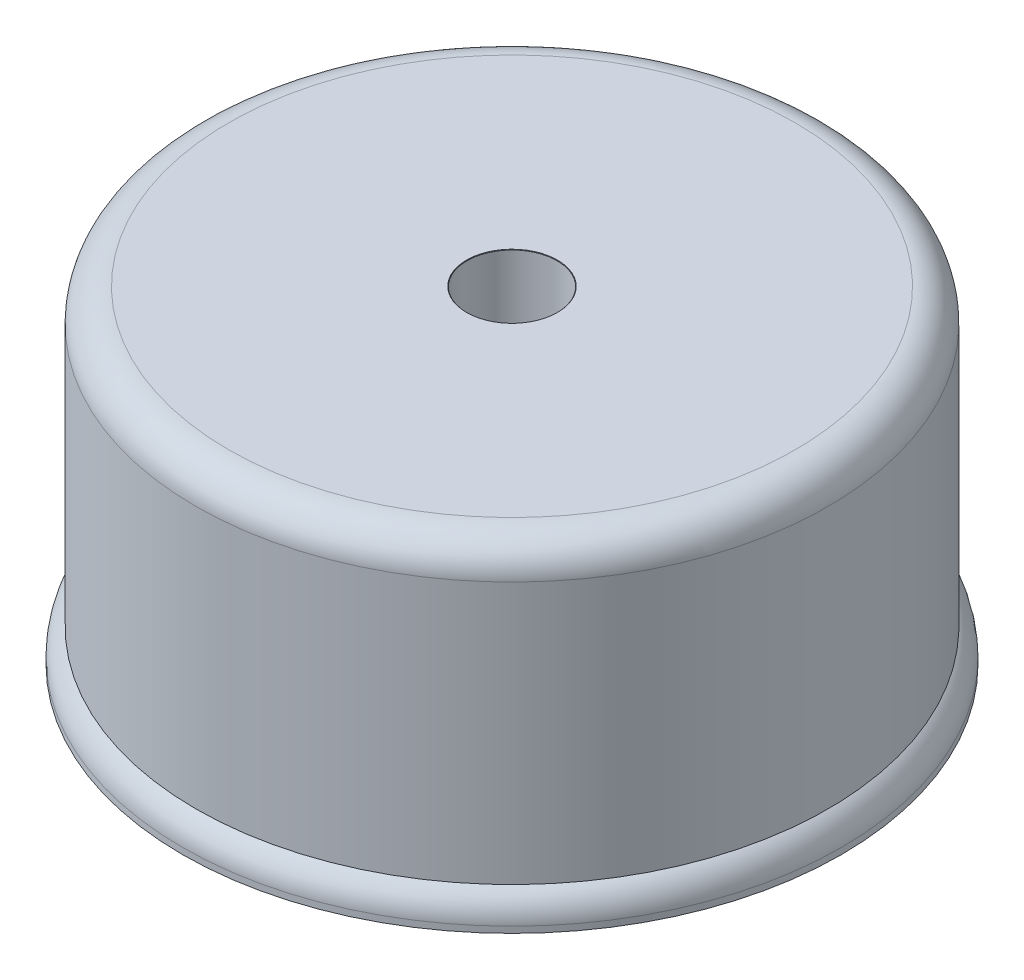
ISO-10303-21;
HEADER;
FILE_DESCRIPTION(('STEP AP214'),'2;1');
FILE_NAME('part.step','',(''),(''),'','','');
FILE_SCHEMA(('AUTOMOTIVE_DESIGN { 1 0 10303 214 1 1 1 1 }'));
ENDSEC;
DATA;
#1=APPLICATION_CONTEXT('core data for automotive mechanical design processes');
#2=APPLICATION_PROTOCOL_DEFINITION('international standard','automotive_design',2000,#1);
#3=PRODUCT_CONTEXT('',#1,'mechanical');
#4=PRODUCT('Part','Part','',(#3));
#5=PRODUCT_RELATED_PRODUCT_CATEGORY('part','',(#4));
#6=PRODUCT_DEFINITION_FORMATION('','',#4);
#7=PRODUCT_DEFINITION_CONTEXT('part definition',#1,'design');
#8=PRODUCT_DEFINITION('design','',#6,#7);
#9=PRODUCT_DEFINITION_SHAPE('','',#8);
#10=(LENGTH_UNIT() NAMED_UNIT(*) SI_UNIT(.MILLI.,.METRE.));
#11=(NAMED_UNIT(*) PLANE_ANGLE_UNIT() SI_UNIT($,.RADIAN.));
#12=(NAMED_UNIT(*) SI_UNIT($,.STERADIAN.) SOLID_ANGLE_UNIT());
#13=UNCERTAINTY_MEASURE_WITH_UNIT(LENGTH_MEASURE(1.E-05),#10,'distance_accuracy_value','');
#14=(GEOMETRIC_REPRESENTATION_CONTEXT(3) GLOBAL_UNCERTAINTY_ASSIGNED_CONTEXT((#13)) GLOBAL_UNIT_ASSIGNED_CONTEXT((#10,
#11,#12)) REPRESENTATION_CONTEXT('',''));
#15=CARTESIAN_POINT('',(0.,0.,0.));
#16=DIRECTION('',(0.,0.,1.));
#17=DIRECTION('',(1.,0.,0.));
#18=AXIS2_PLACEMENT_3D('',#15,#16,#17);
#19=CARTESIAN_POINT('',(0.,20.,0.));
#20=DIRECTION('',(0.,-1.,0.));
#21=DIRECTION('',(0.,0.,-1.));
#22=AXIS2_PLACEMENT_3D('',#19,#20,#21);
#23=CYLINDRICAL_SURFACE('',#22,20.125);
#24=CARTESIAN_POINT('',(0.,0.381551669036057,0.));
#25=DIRECTION('',(0.,1.,0.));
#26=DIRECTION('',(0.,0.,1.));
#27=AXIS2_PLACEMENT_3D('',#24,#25,#26);
#28=CIRCLE('',#27,20.125);
#29=CARTESIAN_POINT('',(0.,0.381551669036057,20.125));
#30=VERTEX_POINT('',#29);
#31=EDGE_CURVE('E13',#30,#30,#28,.F.);
#32=ORIENTED_EDGE('',*,*,#31,.T.);
#33=EDGE_LOOP('',(#32));
#34=FACE_BOUND('',#33,.T.);
#35=CARTESIAN_POINT('',(0.,0.,0.));
#36=DIRECTION('',(0.,1.,0.));
#37=DIRECTION('',(0.,0.,1.));
#38=AXIS2_PLACEMENT_3D('',#35,#36,#37);
#39=CIRCLE('',#38,20.125);
#40=CARTESIAN_POINT('',(0.,0.,20.125));
#41=VERTEX_POINT('',#40);
#42=EDGE_CURVE('E152',#41,#41,#39,.T.);
#43=ORIENTED_EDGE('',*,*,#42,.T.);
#44=EDGE_LOOP('',(#43));
#45=FACE_BOUND('',#44,.T.);
#46=ADVANCED_FACE('F69',(#34,#45),#23,.T.);
#47=CARTESIAN_POINT('',(0.,0.,0.));
#48=DIRECTION('',(0.,1.,0.));
#49=DIRECTION('',(0.,0.,1.));
#50=AXIS2_PLACEMENT_3D('',#47,#48,#49);
#51=PLANE('',#50);
#52=DIRECTION('',(0.,0.,1.));
#53=VECTOR('',#52,1.);
#54=CARTESIAN_POINT('',(10.7480230740355,0.,0.));
#55=LINE('',#54,#53);
#56=CARTESIAN_POINT('',(10.7480230740355,0.,-10.7480230740355));
#57=VERTEX_POINT('',#56);
#58=CARTESIAN_POINT('',(10.7480230740355,0.,10.7480230740355));
#59=VERTEX_POINT('',#58);
#60=EDGE_CURVE('E86',#57,#59,#55,.T.);
#61=ORIENTED_EDGE('',*,*,#60,.F.);
#62=DIRECTION('',(1.,0.,0.));
#63=VECTOR('',#62,1.);
#64=CARTESIAN_POINT('',(0.,0.,-10.7480230740355));
#65=LINE('',#64,#63);
#66=CARTESIAN_POINT('',(-10.7480230740355,0.,-10.7480230740355));
#67=VERTEX_POINT('',#66);
#68=EDGE_CURVE('E124',#67,#57,#65,.T.);
#69=ORIENTED_EDGE('',*,*,#68,.F.);
#70=DIRECTION('',(0.,0.,1.));
#71=VECTOR('',#70,1.);
#72=CARTESIAN_POINT('',(-10.7480230740355,0.,0.));
#73=LINE('',#72,#71);
#74=CARTESIAN_POINT('',(-10.7480230740355,0.,10.7480230740355));
#75=VERTEX_POINT('',#74);
#76=EDGE_CURVE('E140',#67,#75,#73,.T.);
#77=ORIENTED_EDGE('',*,*,#76,.T.);
#78=DIRECTION('',(1.,0.,0.));
#79=VECTOR('',#78,1.);
#80=CARTESIAN_POINT('',(0.,0.,10.7480230740355));
#81=LINE('',#80,#79);
#82=EDGE_CURVE('E147',#75,#59,#81,.T.);
#83=ORIENTED_EDGE('',*,*,#82,.T.);
#84=EDGE_LOOP('',(#61,#69,#77,#83));
#85=FACE_BOUND('',#84,.T.);
#86=ORIENTED_EDGE('',*,*,#42,.F.);
#87=EDGE_LOOP('',(#86));
#88=FACE_BOUND('',#87,.T.);
#89=ADVANCED_FACE('F184',(#85,#88),#51,.F.);
#90=CARTESIAN_POINT('',(0.,15.,0.));
#91=DIRECTION('',(0.,1.,0.));
#92=DIRECTION('',(0.,0.,1.));
#93=AXIS2_PLACEMENT_3D('',#90,#91,#92);
#94=PLANE('',#93);
#95=CARTESIAN_POINT('',(0.,15.,0.));
#96=DIRECTION('',(0.,1.,0.));
#97=DIRECTION('',(0.,0.,1.));
#98=AXIS2_PLACEMENT_3D('',#95,#96,#97);
#99=CIRCLE('',#98,2.75);
#100=CARTESIAN_POINT('',(0.,15.,2.75));
#101=VERTEX_POINT('',#100);
#102=EDGE_CURVE('E73',#101,#101,#99,.T.);
#103=ORIENTED_EDGE('',*,*,#102,.T.);
#104=EDGE_LOOP('',(#103));
#105=FACE_BOUND('',#104,.T.);
#106=DIRECTION('',(1.,0.,0.));
#107=VECTOR('',#106,1.);
#108=CARTESIAN_POINT('',(0.,15.,-10.7480230740355));
#109=LINE('',#108,#107);
#110=CARTESIAN_POINT('',(-10.7480230740355,15.,-10.7480230740355));
#111=VERTEX_POINT('',#110);
#112=CARTESIAN_POINT('',(10.7480230740355,15.,-10.7480230740355));
#113=VERTEX_POINT('',#112);
#114=EDGE_CURVE('E131',#111,#113,#109,.T.);
#115=ORIENTED_EDGE('',*,*,#114,.T.);
#116=DIRECTION('',(0.,0.,1.));
#117=VECTOR('',#116,1.);
#118=CARTESIAN_POINT('',(10.7480230740355,15.,0.));
#119=LINE('',#118,#117);
#120=CARTESIAN_POINT('',(10.7480230740355,15.,10.7480230740355));
#121=VERTEX_POINT('',#120);
#122=EDGE_CURVE('E107',#113,#121,#119,.T.);
#123=ORIENTED_EDGE('',*,*,#122,.T.);
#124=DIRECTION('',(1.,0.,0.));
#125=VECTOR('',#124,1.);
#126=CARTESIAN_POINT('',(0.,15.,10.7480230740355));
#127=LINE('',#126,#125);
#128=CARTESIAN_POINT('',(-10.7480230740355,15.,10.7480230740355));
#129=VERTEX_POINT('',#128);
#130=EDGE_CURVE('E115',#129,#121,#127,.T.);
#131=ORIENTED_EDGE('',*,*,#130,.F.);
#132=DIRECTION('',(0.,0.,1.));
#133=VECTOR('',#132,1.);
#134=CARTESIAN_POINT('',(-10.7480230740355,15.,0.));
#135=LINE('',#134,#133);
#136=EDGE_CURVE('E125',#111,#129,#135,.T.);
#137=ORIENTED_EDGE('',*,*,#136,.F.);
#138=EDGE_LOOP('',(#115,#123,#131,#137));
#139=FACE_BOUND('',#138,.T.);
#140=ADVANCED_FACE('F130',(#105,#139),#94,.F.);
#141=CARTESIAN_POINT('',(0.,60.4,-10.7480230740355));
#142=DIRECTION('',(0.,0.,-1.));
#143=DIRECTION('',(-1.,0.,0.));
#144=AXIS2_PLACEMENT_3D('',#141,#142,#143);
#145=PLANE('',#144);
#146=DIRECTION('',(0.,-1.,0.));
#147=VECTOR('',#146,1.);
#148=CARTESIAN_POINT('',(-10.7480230740355,60.4,-10.7480230740355));
#149=LINE('',#148,#147);
#150=EDGE_CURVE('E144',#111,#67,#149,.T.);
#151=ORIENTED_EDGE('',*,*,#150,.T.);
#152=ORIENTED_EDGE('',*,*,#68,.T.);
#153=DIRECTION('',(0.,-1.,0.));
#154=VECTOR('',#153,1.);
#155=CARTESIAN_POINT('',(10.7480230740355,60.4,-10.7480230740355));
#156=LINE('',#155,#154);
#157=EDGE_CURVE('E92',#113,#57,#156,.T.);
#158=ORIENTED_EDGE('',*,*,#157,.F.);
#159=ORIENTED_EDGE('',*,*,#114,.F.);
#160=EDGE_LOOP('',(#151,#152,#158,#159));
#161=FACE_BOUND('',#160,.T.);
#162=ADVANCED_FACE('F191',(#161),#145,.F.);
#163=CARTESIAN_POINT('',(-10.7480230740355,60.4,0.));
#164=DIRECTION('',(1.,0.,0.));
#165=DIRECTION('',(0.,0.,-1.));
#166=AXIS2_PLACEMENT_3D('',#163,#164,#165);
#167=PLANE('',#166);
#168=ORIENTED_EDGE('',*,*,#136,.T.);
#169=DIRECTION('',(0.,-1.,0.));
#170=VECTOR('',#169,1.);
#171=CARTESIAN_POINT('',(-10.7480230740355,60.4,10.7480230740355));
#172=LINE('',#171,#170);
#173=EDGE_CURVE('E120',#129,#75,#172,.T.);
#174=ORIENTED_EDGE('',*,*,#173,.T.);
#175=ORIENTED_EDGE('',*,*,#76,.F.);
#176=ORIENTED_EDGE('',*,*,#150,.F.);
#177=EDGE_LOOP('',(#168,#174,#175,#176));
#178=FACE_BOUND('',#177,.T.);
#179=ADVANCED_FACE('F224',(#178),#167,.T.);
#180=CARTESIAN_POINT('',(10.7480230740355,60.4,0.));
#181=DIRECTION('',(1.,0.,0.));
#182=DIRECTION('',(0.,0.,-1.));
#183=AXIS2_PLACEMENT_3D('',#180,#181,#182);
#184=PLANE('',#183);
#185=ORIENTED_EDGE('',*,*,#157,.T.);
#186=ORIENTED_EDGE('',*,*,#60,.T.);
#187=DIRECTION('',(0.,-1.,0.));
#188=VECTOR('',#187,1.);
#189=CARTESIAN_POINT('',(10.7480230740355,60.4,10.7480230740355));
#190=LINE('',#189,#188);
#191=EDGE_CURVE('E118',#121,#59,#190,.T.);
#192=ORIENTED_EDGE('',*,*,#191,.F.);
#193=ORIENTED_EDGE('',*,*,#122,.F.);
#194=EDGE_LOOP('',(#185,#186,#192,#193));
#195=FACE_BOUND('',#194,.T.);
#196=ADVANCED_FACE('F127',(#195),#184,.F.);
#197=CARTESIAN_POINT('',(0.,60.4,10.7480230740355));
#198=DIRECTION('',(0.,0.,-1.));
#199=DIRECTION('',(-1.,0.,0.));
#200=AXIS2_PLACEMENT_3D('',#197,#198,#199);
#201=PLANE('',#200);
#202=ORIENTED_EDGE('',*,*,#130,.T.);
#203=ORIENTED_EDGE('',*,*,#191,.T.);
#204=ORIENTED_EDGE('',*,*,#82,.F.);
#205=ORIENTED_EDGE('',*,*,#173,.F.);
#206=EDGE_LOOP('',(#202,#203,#204,#205));
#207=FACE_BOUND('',#206,.T.);
#208=ADVANCED_FACE('F116',(#207),#201,.T.);
#209=CARTESIAN_POINT('',(0.,-56.9220958855171,0.));
#210=DIRECTION('',(0.,1.,0.));
#211=DIRECTION('',(0.,0.,1.));
#212=AXIS2_PLACEMENT_3D('',#209,#210,#211);
#213=CYLINDRICAL_SURFACE('',#212,19.3);
#214=CARTESIAN_POINT('',(0.,18.,0.));
#215=DIRECTION('',(0.,1.,0.));
#216=DIRECTION('',(0.,0.,1.));
#217=AXIS2_PLACEMENT_3D('',#214,#215,#216);
#218=CIRCLE('',#217,19.3);
#219=CARTESIAN_POINT('',(0.,18.,19.3));
#220=VERTEX_POINT('',#219);
#221=EDGE_CURVE('E79',#220,#220,#218,.F.);
#222=ORIENTED_EDGE('',*,*,#221,.T.);
#223=EDGE_LOOP('',(#222));
#224=FACE_BOUND('',#223,.T.);
#225=CARTESIAN_POINT('',(0.,2.,0.));
#226=DIRECTION('',(0.,1.,0.));
#227=DIRECTION('',(0.,0.,1.));
#228=AXIS2_PLACEMENT_3D('',#225,#226,#227);
#229=CIRCLE('',#228,19.3);
#230=CARTESIAN_POINT('',(0.,2.,19.3));
#231=VERTEX_POINT('',#230);
#232=EDGE_CURVE('E142',#231,#231,#229,.F.);
#233=ORIENTED_EDGE('',*,*,#232,.F.);
#234=EDGE_LOOP('',(#233));
#235=FACE_BOUND('',#234,.T.);
#236=ADVANCED_FACE('F164',(#224,#235),#213,.T.);
#237=CARTESIAN_POINT('',(0.,20.,0.));
#238=DIRECTION('',(0.,1.,0.));
#239=DIRECTION('',(0.,0.,1.));
#240=AXIS2_PLACEMENT_3D('',#237,#238,#239);
#241=PLANE('',#240);
#242=CARTESIAN_POINT('',(0.,20.,0.));
#243=DIRECTION('',(0.,1.,0.));
#244=DIRECTION('',(0.,0.,1.));
#245=AXIS2_PLACEMENT_3D('',#242,#243,#244);
#246=CIRCLE('',#245,2.775);
#247=CARTESIAN_POINT('',(0.,20.,2.775));
#248=VERTEX_POINT('',#247);
#249=EDGE_CURVE('E354',#248,#248,#246,.T.);
#250=ORIENTED_EDGE('',*,*,#249,.F.);
#251=EDGE_LOOP('',(#250));
#252=FACE_BOUND('',#251,.T.);
#253=CARTESIAN_POINT('',(0.,20.,0.));
#254=DIRECTION('',(0.,1.,0.));
#255=DIRECTION('',(0.,0.,1.));
#256=AXIS2_PLACEMENT_3D('',#253,#254,#255);
#257=CIRCLE('',#256,17.3);
#258=CARTESIAN_POINT('',(0.,20.,17.3));
#259=VERTEX_POINT('',#258);
#260=EDGE_CURVE('E156',#259,#259,#257,.T.);
#261=ORIENTED_EDGE('',*,*,#260,.T.);
#262=EDGE_LOOP('',(#261));
#263=FACE_BOUND('',#262,.T.);
#264=ADVANCED_FACE('F170',(#252,#263),#241,.T.);
#265=CARTESIAN_POINT('',(0.,18.,0.));
#266=DIRECTION('',(0.,1.,0.));
#267=DIRECTION('',(0.,0.,1.));
#268=AXIS2_PLACEMENT_3D('',#265,#266,#267);
#269=TOROIDAL_SURFACE('',#268,17.3,2.);
#270=ORIENTED_EDGE('',*,*,#221,.F.);
#271=EDGE_LOOP('',(#270));
#272=FACE_BOUND('',#271,.T.);
#273=ORIENTED_EDGE('',*,*,#260,.F.);
#274=EDGE_LOOP('',(#273));
#275=FACE_BOUND('',#274,.T.);
#276=ADVANCED_FACE('F167',(#272,#275),#269,.T.);
#277=CARTESIAN_POINT('',(0.,0.381551669036057,0.));
#278=DIRECTION('',(0.,1.,0.));
#279=DIRECTION('',(0.,0.,1.));
#280=AXIS2_PLACEMENT_3D('',#277,#278,#279);
#281=TOROIDAL_SURFACE('',#280,18.125,2.);
#282=ORIENTED_EDGE('',*,*,#232,.T.);
#283=EDGE_LOOP('',(#282));
#284=FACE_BOUND('',#283,.T.);
#285=ORIENTED_EDGE('',*,*,#31,.F.);
#286=EDGE_LOOP('',(#285));
#287=FACE_BOUND('',#286,.T.);
#288=ADVANCED_FACE('F71',(#284,#287),#281,.T.);
#289=CARTESIAN_POINT('',(0.,20.,0.));
#290=DIRECTION('',(0.,1.,0.));
#291=DIRECTION('',(0.,0.,1.));
#292=AXIS2_PLACEMENT_3D('',#289,#290,#291);
#293=CYLINDRICAL_SURFACE('',#292,2.75);
#294=CARTESIAN_POINT('',(0.,19.975,0.));
#295=DIRECTION('',(0.,1.,0.));
#296=DIRECTION('',(0.,0.,1.));
#297=AXIS2_PLACEMENT_3D('',#294,#295,#296);
#298=CIRCLE('',#297,2.75);
#299=CARTESIAN_POINT('',(0.,19.975,2.75));
#300=VERTEX_POINT('',#299);
#301=EDGE_CURVE('E212',#300,#300,#298,.T.);
#302=ORIENTED_EDGE('',*,*,#301,.T.);
#303=EDGE_LOOP('',(#302));
#304=FACE_BOUND('',#303,.T.);
#305=ORIENTED_EDGE('',*,*,#102,.F.);
#306=EDGE_LOOP('',(#305));
#307=FACE_BOUND('',#306,.T.);
#308=ADVANCED_FACE('F198',(#304,#307),#293,.F.);
#309=CARTESIAN_POINT('',(0.,20.,0.));
#310=DIRECTION('',(0.,1.,0.));
#311=DIRECTION('',(0.,0.,1.));
#312=AXIS2_PLACEMENT_3D('',#309,#310,#311);
#313=CONICAL_SURFACE('',#312,2.775,0.7853981633975);
#314=ORIENTED_EDGE('',*,*,#301,.F.);
#315=EDGE_LOOP('',(#314));
#316=FACE_BOUND('',#315,.T.);
#317=ORIENTED_EDGE('',*,*,#249,.T.);
#318=EDGE_LOOP('',(#317));
#319=FACE_BOUND('',#318,.T.);
#320=ADVANCED_FACE('F203',(#316,#319),#313,.F.);
#321=CLOSED_SHELL('',(#46,#89,#140,#162,#179,#196,#208,#236,#264,#276,#288,#308,#320));
#322=MANIFOLD_SOLID_BREP('B2',#321);
#323=ADVANCED_BREP_SHAPE_REPRESENTATION('',(#18,#322),#14);
#324=SHAPE_DEFINITION_REPRESENTATION(#9,#323);
ENDSEC;
END-ISO-10303-21;
